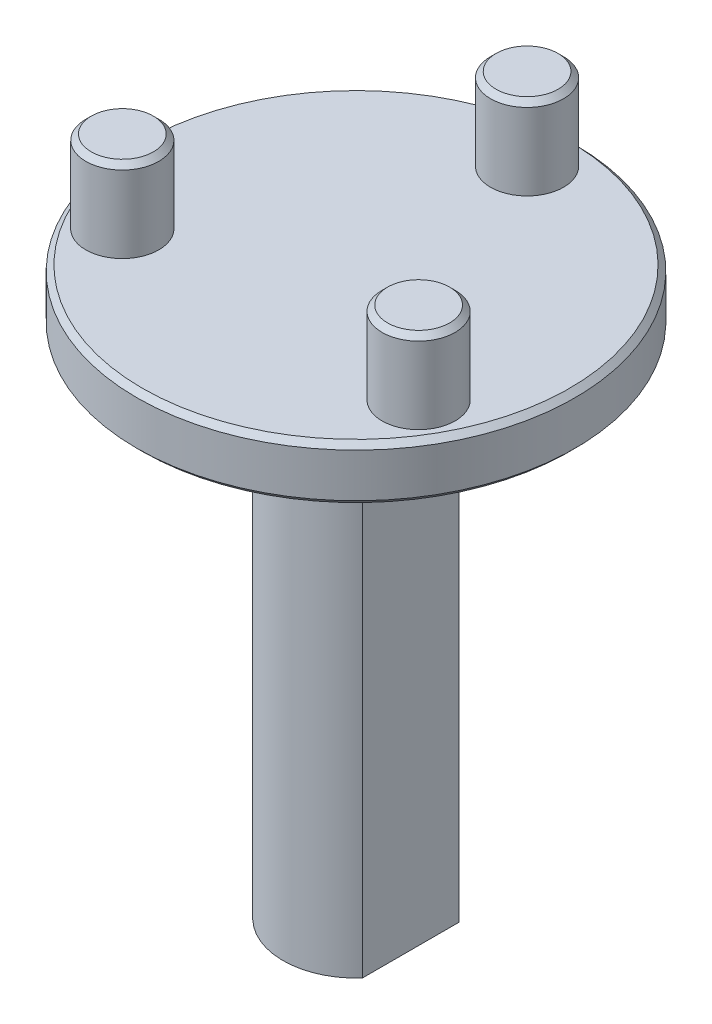
ISO-10303-21;
HEADER;
FILE_DESCRIPTION(('STEP AP214'),'2;1');
FILE_NAME('part.step','',(''),(''),'','','');
FILE_SCHEMA(('AUTOMOTIVE_DESIGN { 1 0 10303 214 1 1 1 1 }'));
ENDSEC;
DATA;
#1=APPLICATION_CONTEXT('core data for automotive mechanical design processes');
#2=APPLICATION_PROTOCOL_DEFINITION('international standard','automotive_design',2000,#1);
#3=PRODUCT_CONTEXT('',#1,'mechanical');
#4=PRODUCT('Part','Part','',(#3));
#5=PRODUCT_RELATED_PRODUCT_CATEGORY('part','',(#4));
#6=PRODUCT_DEFINITION_FORMATION('','',#4);
#7=PRODUCT_DEFINITION_CONTEXT('part definition',#1,'design');
#8=PRODUCT_DEFINITION('design','',#6,#7);
#9=PRODUCT_DEFINITION_SHAPE('','',#8);
#10=(LENGTH_UNIT() NAMED_UNIT(*) SI_UNIT(.MILLI.,.METRE.));
#11=(NAMED_UNIT(*) PLANE_ANGLE_UNIT() SI_UNIT($,.RADIAN.));
#12=(NAMED_UNIT(*) SI_UNIT($,.STERADIAN.) SOLID_ANGLE_UNIT());
#13=UNCERTAINTY_MEASURE_WITH_UNIT(LENGTH_MEASURE(1.E-05),#10,'distance_accuracy_value','');
#14=(GEOMETRIC_REPRESENTATION_CONTEXT(3) GLOBAL_UNCERTAINTY_ASSIGNED_CONTEXT((#13)) GLOBAL_UNIT_ASSIGNED_CONTEXT((#10,
#11,#12)) REPRESENTATION_CONTEXT('',''));
#15=CARTESIAN_POINT('',(0.,0.,0.));
#16=DIRECTION('',(0.,0.,1.));
#17=DIRECTION('',(1.,0.,0.));
#18=AXIS2_PLACEMENT_3D('',#15,#16,#17);
#19=CARTESIAN_POINT('',(0.,3.,0.));
#20=DIRECTION('',(0.,-1.,0.));
#21=DIRECTION('',(0.,0.,-1.));
#22=AXIS2_PLACEMENT_3D('',#19,#20,#21);
#23=CYLINDRICAL_SURFACE('',#22,12.);
#24=CARTESIAN_POINT('',(0.,0.299999999999998,0.));
#25=DIRECTION('',(0.,1.,0.));
#26=DIRECTION('',(0.,0.,1.));
#27=AXIS2_PLACEMENT_3D('',#24,#25,#26);
#28=CIRCLE('',#27,12.);
#29=CARTESIAN_POINT('',(0.,0.299999999999998,12.));
#30=VERTEX_POINT('',#29);
#31=EDGE_CURVE('E110',#30,#30,#28,.T.);
#32=ORIENTED_EDGE('',*,*,#31,.T.);
#33=EDGE_LOOP('',(#32));
#34=FACE_BOUND('',#33,.T.);
#35=CARTESIAN_POINT('',(0.,2.70000000000001,0.));
#36=DIRECTION('',(0.,1.,0.));
#37=DIRECTION('',(0.,0.,1.));
#38=AXIS2_PLACEMENT_3D('',#35,#36,#37);
#39=CIRCLE('',#38,12.);
#40=CARTESIAN_POINT('',(0.,2.70000000000001,12.));
#41=VERTEX_POINT('',#40);
#42=EDGE_CURVE('E107',#41,#41,#39,.F.);
#43=ORIENTED_EDGE('',*,*,#42,.T.);
#44=EDGE_LOOP('',(#43));
#45=FACE_BOUND('',#44,.T.);
#46=ADVANCED_FACE('F39',(#34,#45),#23,.T.);
#47=CARTESIAN_POINT('',(0.,3.,0.));
#48=DIRECTION('',(0.,1.,0.));
#49=DIRECTION('',(0.,0.,1.));
#50=AXIS2_PLACEMENT_3D('',#47,#48,#49);
#51=PLANE('',#50);
#52=CARTESIAN_POINT('',(0.,3.,0.));
#53=DIRECTION('',(0.,1.,0.));
#54=DIRECTION('',(0.,0.,1.));
#55=AXIS2_PLACEMENT_3D('',#52,#53,#54);
#56=CIRCLE('',#55,11.7);
#57=CARTESIAN_POINT('',(0.,3.,11.7));
#58=VERTEX_POINT('',#57);
#59=EDGE_CURVE('E116',#58,#58,#56,.T.);
#60=ORIENTED_EDGE('',*,*,#59,.T.);
#61=EDGE_LOOP('',(#60));
#62=FACE_BOUND('',#61,.T.);
#63=CARTESIAN_POINT('',(8.1146580334602,3.,4.68499999999998));
#64=DIRECTION('',(0.,1.,0.));
#65=DIRECTION('',(0.,0.,1.));
#66=AXIS2_PLACEMENT_3D('',#63,#64,#65);
#67=CIRCLE('',#66,2.);
#68=CARTESIAN_POINT('',(8.1146580334602,3.,6.68499999999998));
#69=VERTEX_POINT('',#68);
#70=EDGE_CURVE('E89',#69,#69,#67,.T.);
#71=ORIENTED_EDGE('',*,*,#70,.F.);
#72=EDGE_LOOP('',(#71));
#73=FACE_BOUND('',#72,.T.);
#74=CARTESIAN_POINT('',(-8.1146580334602,3.,4.68499999999998));
#75=DIRECTION('',(0.,1.,0.));
#76=DIRECTION('',(0.,0.,1.));
#77=AXIS2_PLACEMENT_3D('',#74,#75,#76);
#78=CIRCLE('',#77,2.);
#79=CARTESIAN_POINT('',(-8.1146580334602,3.,6.68499999999998));
#80=VERTEX_POINT('',#79);
#81=EDGE_CURVE('E97',#80,#80,#78,.T.);
#82=ORIENTED_EDGE('',*,*,#81,.F.);
#83=EDGE_LOOP('',(#82));
#84=FACE_BOUND('',#83,.T.);
#85=CARTESIAN_POINT('',(0.,3.,-9.37));
#86=DIRECTION('',(0.,1.,0.));
#87=DIRECTION('',(0.,0.,1.));
#88=AXIS2_PLACEMENT_3D('',#85,#86,#87);
#89=CIRCLE('',#88,2.);
#90=CARTESIAN_POINT('',(0.,3.,-7.37));
#91=VERTEX_POINT('',#90);
#92=EDGE_CURVE('E94',#91,#91,#89,.T.);
#93=ORIENTED_EDGE('',*,*,#92,.F.);
#94=EDGE_LOOP('',(#93));
#95=FACE_BOUND('',#94,.T.);
#96=ADVANCED_FACE('F139',(#62,#73,#84,#95),#51,.T.);
#97=CARTESIAN_POINT('',(0.,0.,0.));
#98=DIRECTION('',(0.,1.,0.));
#99=DIRECTION('',(0.,0.,1.));
#100=AXIS2_PLACEMENT_3D('',#97,#98,#99);
#101=PLANE('',#100);
#102=CARTESIAN_POINT('',(0.,0.,0.));
#103=DIRECTION('',(0.,1.,0.));
#104=DIRECTION('',(0.,0.,1.));
#105=AXIS2_PLACEMENT_3D('',#102,#103,#104);
#106=CIRCLE('',#105,11.7);
#107=CARTESIAN_POINT('',(0.,0.,11.7));
#108=VERTEX_POINT('',#107);
#109=EDGE_CURVE('E113',#108,#108,#106,.F.);
#110=ORIENTED_EDGE('',*,*,#109,.T.);
#111=EDGE_LOOP('',(#110));
#112=FACE_BOUND('',#111,.T.);
#113=CARTESIAN_POINT('',(0.,0.,0.));
#114=DIRECTION('',(0.,-1.,0.));
#115=DIRECTION('',(0.,0.,-1.));
#116=AXIS2_PLACEMENT_3D('',#113,#114,#115);
#117=CIRCLE('',#116,5.);
#118=CARTESIAN_POINT('',(0.,0.,-5.));
#119=VERTEX_POINT('',#118);
#120=EDGE_CURVE('E90',#119,#119,#117,.T.);
#121=ORIENTED_EDGE('',*,*,#120,.F.);
#122=EDGE_LOOP('',(#121));
#123=FACE_BOUND('',#122,.T.);
#124=ADVANCED_FACE('F145',(#112,#123),#101,.F.);
#125=CARTESIAN_POINT('',(0.,7.5,-9.37));
#126=DIRECTION('',(0.,-1.,0.));
#127=DIRECTION('',(0.,0.,-1.));
#128=AXIS2_PLACEMENT_3D('',#125,#126,#127);
#129=CYLINDRICAL_SURFACE('',#128,2.);
#130=CARTESIAN_POINT('',(0.,7.19999999999999,-9.37));
#131=DIRECTION('',(0.,1.,0.));
#132=DIRECTION('',(0.,0.,1.));
#133=AXIS2_PLACEMENT_3D('',#130,#131,#132);
#134=CIRCLE('',#133,2.);
#135=CARTESIAN_POINT('',(0.,7.19999999999999,-7.37));
#136=VERTEX_POINT('',#135);
#137=EDGE_CURVE('E122',#136,#136,#134,.F.);
#138=ORIENTED_EDGE('',*,*,#137,.T.);
#139=EDGE_LOOP('',(#138));
#140=FACE_BOUND('',#139,.T.);
#141=ORIENTED_EDGE('',*,*,#92,.T.);
#142=EDGE_LOOP('',(#141));
#143=FACE_BOUND('',#142,.T.);
#144=ADVANCED_FACE('F188',(#140,#143),#129,.T.);
#145=CARTESIAN_POINT('',(0.,7.5,-9.37));
#146=DIRECTION('',(0.,1.,0.));
#147=DIRECTION('',(0.,0.,1.));
#148=AXIS2_PLACEMENT_3D('',#145,#146,#147);
#149=PLANE('',#148);
#150=CARTESIAN_POINT('',(0.,7.5,-9.37));
#151=DIRECTION('',(0.,1.,0.));
#152=DIRECTION('',(0.,0.,1.));
#153=AXIS2_PLACEMENT_3D('',#150,#151,#152);
#154=CIRCLE('',#153,1.69999999999999);
#155=CARTESIAN_POINT('',(0.,7.5,-7.67000000000001));
#156=VERTEX_POINT('',#155);
#157=EDGE_CURVE('E119',#156,#156,#154,.T.);
#158=ORIENTED_EDGE('',*,*,#157,.T.);
#159=EDGE_LOOP('',(#158));
#160=FACE_BOUND('',#159,.T.);
#161=ADVANCED_FACE('F190',(#160),#149,.T.);
#162=CARTESIAN_POINT('',(-8.1146580334602,7.5,4.68499999999998));
#163=DIRECTION('',(0.,-1.,0.));
#164=DIRECTION('',(0.,0.,-1.));
#165=AXIS2_PLACEMENT_3D('',#162,#163,#164);
#166=CYLINDRICAL_SURFACE('',#165,2.);
#167=CARTESIAN_POINT('',(-8.1146580334602,7.2,4.68499999999998));
#168=DIRECTION('',(0.,1.,0.));
#169=DIRECTION('',(0.,0.,1.));
#170=AXIS2_PLACEMENT_3D('',#167,#168,#169);
#171=CIRCLE('',#170,2.);
#172=CARTESIAN_POINT('',(-8.1146580334602,7.2,6.68499999999998));
#173=VERTEX_POINT('',#172);
#174=EDGE_CURVE('E104',#173,#173,#171,.F.);
#175=ORIENTED_EDGE('',*,*,#174,.T.);
#176=EDGE_LOOP('',(#175));
#177=FACE_BOUND('',#176,.T.);
#178=ORIENTED_EDGE('',*,*,#81,.T.);
#179=EDGE_LOOP('',(#178));
#180=FACE_BOUND('',#179,.T.);
#181=ADVANCED_FACE('F197',(#177,#180),#166,.T.);
#182=CARTESIAN_POINT('',(-8.1146580334602,7.5,4.68499999999998));
#183=DIRECTION('',(0.,1.,0.));
#184=DIRECTION('',(0.,0.,1.));
#185=AXIS2_PLACEMENT_3D('',#182,#183,#184);
#186=PLANE('',#185);
#187=CARTESIAN_POINT('',(-8.1146580334602,7.5,4.68499999999998));
#188=DIRECTION('',(0.,1.,0.));
#189=DIRECTION('',(0.,0.,1.));
#190=AXIS2_PLACEMENT_3D('',#187,#188,#189);
#191=CIRCLE('',#190,1.7);
#192=CARTESIAN_POINT('',(-8.1146580334602,7.5,6.38499999999998));
#193=VERTEX_POINT('',#192);
#194=EDGE_CURVE('E93',#193,#193,#191,.T.);
#195=ORIENTED_EDGE('',*,*,#194,.T.);
#196=EDGE_LOOP('',(#195));
#197=FACE_BOUND('',#196,.T.);
#198=ADVANCED_FACE('F202',(#197),#186,.T.);
#199=CARTESIAN_POINT('',(8.1146580334602,7.5,4.68499999999998));
#200=DIRECTION('',(0.,-1.,0.));
#201=DIRECTION('',(0.,0.,-1.));
#202=AXIS2_PLACEMENT_3D('',#199,#200,#201);
#203=CYLINDRICAL_SURFACE('',#202,2.);
#204=CARTESIAN_POINT('',(8.1146580334602,7.2,4.68499999999998));
#205=DIRECTION('',(0.,1.,0.));
#206=DIRECTION('',(0.,0.,1.));
#207=AXIS2_PLACEMENT_3D('',#204,#205,#206);
#208=CIRCLE('',#207,2.);
#209=CARTESIAN_POINT('',(8.1146580334602,7.2,6.68499999999998));
#210=VERTEX_POINT('',#209);
#211=EDGE_CURVE('E11',#210,#210,#208,.F.);
#212=ORIENTED_EDGE('',*,*,#211,.T.);
#213=EDGE_LOOP('',(#212));
#214=FACE_BOUND('',#213,.T.);
#215=ORIENTED_EDGE('',*,*,#70,.T.);
#216=EDGE_LOOP('',(#215));
#217=FACE_BOUND('',#216,.T.);
#218=ADVANCED_FACE('F205',(#214,#217),#203,.T.);
#219=CARTESIAN_POINT('',(8.1146580334602,7.5,4.68499999999998));
#220=DIRECTION('',(0.,1.,0.));
#221=DIRECTION('',(0.,0.,1.));
#222=AXIS2_PLACEMENT_3D('',#219,#220,#221);
#223=PLANE('',#222);
#224=CARTESIAN_POINT('',(8.1146580334602,7.5,4.68499999999998));
#225=DIRECTION('',(0.,1.,0.));
#226=DIRECTION('',(0.,0.,1.));
#227=AXIS2_PLACEMENT_3D('',#224,#225,#226);
#228=CIRCLE('',#227,1.7);
#229=CARTESIAN_POINT('',(8.1146580334602,7.5,6.38499999999998));
#230=VERTEX_POINT('',#229);
#231=EDGE_CURVE('E48',#230,#230,#228,.T.);
#232=ORIENTED_EDGE('',*,*,#231,.T.);
#233=EDGE_LOOP('',(#232));
#234=FACE_BOUND('',#233,.T.);
#235=ADVANCED_FACE('F127',(#234),#223,.T.);
#236=CARTESIAN_POINT('',(0.,-1.,0.));
#237=DIRECTION('',(0.,1.,0.));
#238=DIRECTION('',(0.,0.,1.));
#239=AXIS2_PLACEMENT_3D('',#236,#237,#238);
#240=CYLINDRICAL_SURFACE('',#239,5.);
#241=CARTESIAN_POINT('',(0.,-1.,0.));
#242=DIRECTION('',(0.,-1.,0.));
#243=DIRECTION('',(0.,0.,-1.));
#244=AXIS2_PLACEMENT_3D('',#241,#242,#243);
#245=CIRCLE('',#244,5.);
#246=CARTESIAN_POINT('',(0.,-1.,-5.));
#247=VERTEX_POINT('',#246);
#248=EDGE_CURVE('E83',#247,#247,#245,.T.);
#249=ORIENTED_EDGE('',*,*,#248,.F.);
#250=EDGE_LOOP('',(#249));
#251=FACE_BOUND('',#250,.T.);
#252=ORIENTED_EDGE('',*,*,#120,.T.);
#253=EDGE_LOOP('',(#252));
#254=FACE_BOUND('',#253,.T.);
#255=ADVANCED_FACE('F212',(#251,#254),#240,.T.);
#256=CARTESIAN_POINT('',(0.,-1.,0.));
#257=DIRECTION('',(0.,-1.,0.));
#258=DIRECTION('',(0.,0.,-1.));
#259=AXIS2_PLACEMENT_3D('',#256,#257,#258);
#260=PLANE('',#259);
#261=CARTESIAN_POINT('',(0.,-1.,0.));
#262=DIRECTION('',(0.,-1.,0.));
#263=DIRECTION('',(0.,0.,-1.));
#264=AXIS2_PLACEMENT_3D('',#261,#262,#263);
#265=CIRCLE('',#264,4.);
#266=CARTESIAN_POINT('',(3.,-1.,2.64575131106459));
#267=VERTEX_POINT('',#266);
#268=CARTESIAN_POINT('',(3.,-1.,-2.64575131106459));
#269=VERTEX_POINT('',#268);
#270=EDGE_CURVE('E67',#267,#269,#265,.T.);
#271=ORIENTED_EDGE('',*,*,#270,.F.);
#272=DIRECTION('',(0.,0.,1.));
#273=VECTOR('',#272,1.);
#274=CARTESIAN_POINT('',(3.,-1.,2.64575131106459));
#275=LINE('',#274,#273);
#276=EDGE_CURVE('E54',#269,#267,#275,.T.);
#277=ORIENTED_EDGE('',*,*,#276,.F.);
#278=EDGE_LOOP('',(#271,#277));
#279=FACE_BOUND('',#278,.T.);
#280=ORIENTED_EDGE('',*,*,#248,.T.);
#281=EDGE_LOOP('',(#280));
#282=FACE_BOUND('',#281,.T.);
#283=ADVANCED_FACE('F68',(#279,#282),#260,.T.);
#284=CARTESIAN_POINT('',(0.,-28.,0.));
#285=DIRECTION('',(0.,1.,0.));
#286=DIRECTION('',(0.,0.,1.));
#287=AXIS2_PLACEMENT_3D('',#284,#285,#286);
#288=CYLINDRICAL_SURFACE('',#287,4.);
#289=ORIENTED_EDGE('',*,*,#270,.T.);
#290=DIRECTION('',(0.,1.,0.));
#291=VECTOR('',#290,1.);
#292=CARTESIAN_POINT('',(3.,-28.,-2.64575131106459));
#293=LINE('',#292,#291);
#294=CARTESIAN_POINT('',(3.,-28.,-2.64575131106459));
#295=VERTEX_POINT('',#294);
#296=EDGE_CURVE('E78',#295,#269,#293,.T.);
#297=ORIENTED_EDGE('',*,*,#296,.F.);
#298=CARTESIAN_POINT('',(0.,-28.,0.));
#299=DIRECTION('',(0.,-1.,0.));
#300=DIRECTION('',(0.,0.,-1.));
#301=AXIS2_PLACEMENT_3D('',#298,#299,#300);
#302=CIRCLE('',#301,4.);
#303=CARTESIAN_POINT('',(3.,-28.,2.64575131106459));
#304=VERTEX_POINT('',#303);
#305=EDGE_CURVE('E79',#304,#295,#302,.T.);
#306=ORIENTED_EDGE('',*,*,#305,.F.);
#307=DIRECTION('',(0.,1.,0.));
#308=VECTOR('',#307,1.);
#309=CARTESIAN_POINT('',(3.,-28.,2.64575131106459));
#310=LINE('',#309,#308);
#311=EDGE_CURVE('E76',#304,#267,#310,.T.);
#312=ORIENTED_EDGE('',*,*,#311,.T.);
#313=EDGE_LOOP('',(#289,#297,#306,#312));
#314=FACE_BOUND('',#313,.T.);
#315=ADVANCED_FACE('F81',(#314),#288,.T.);
#316=CARTESIAN_POINT('',(3.,-28.,2.64575131106459));
#317=DIRECTION('',(-1.,0.,0.));
#318=DIRECTION('',(0.,0.,1.));
#319=AXIS2_PLACEMENT_3D('',#316,#317,#318);
#320=PLANE('',#319);
#321=ORIENTED_EDGE('',*,*,#276,.T.);
#322=ORIENTED_EDGE('',*,*,#311,.F.);
#323=DIRECTION('',(0.,0.,1.));
#324=VECTOR('',#323,1.);
#325=CARTESIAN_POINT('',(3.,-28.,2.64575131106459));
#326=LINE('',#325,#324);
#327=EDGE_CURVE('E62',#295,#304,#326,.T.);
#328=ORIENTED_EDGE('',*,*,#327,.F.);
#329=ORIENTED_EDGE('',*,*,#296,.T.);
#330=EDGE_LOOP('',(#321,#322,#328,#329));
#331=FACE_BOUND('',#330,.T.);
#332=ADVANCED_FACE('F75',(#331),#320,.F.);
#333=CARTESIAN_POINT('',(0.,-28.,0.));
#334=DIRECTION('',(0.,-1.,0.));
#335=DIRECTION('',(0.,0.,-1.));
#336=AXIS2_PLACEMENT_3D('',#333,#334,#335);
#337=PLANE('',#336);
#338=ORIENTED_EDGE('',*,*,#305,.T.);
#339=ORIENTED_EDGE('',*,*,#327,.T.);
#340=EDGE_LOOP('',(#338,#339));
#341=FACE_BOUND('',#340,.T.);
#342=ADVANCED_FACE('F159',(#341),#337,.T.);
#343=CARTESIAN_POINT('',(-8.1146580334602,7.5,4.68499999999998));
#344=DIRECTION('',(0.,-1.,0.));
#345=DIRECTION('',(0.,0.,-1.));
#346=AXIS2_PLACEMENT_3D('',#343,#344,#345);
#347=CONICAL_SURFACE('',#346,1.7,0.785398163397452);
#348=ORIENTED_EDGE('',*,*,#174,.F.);
#349=EDGE_LOOP('',(#348));
#350=FACE_BOUND('',#349,.T.);
#351=ORIENTED_EDGE('',*,*,#194,.F.);
#352=EDGE_LOOP('',(#351));
#353=FACE_BOUND('',#352,.T.);
#354=ADVANCED_FACE('F152',(#350,#353),#347,.T.);
#355=CARTESIAN_POINT('',(0.,0.299999999999998,0.));
#356=DIRECTION('',(0.,1.,0.));
#357=DIRECTION('',(0.,0.,1.));
#358=AXIS2_PLACEMENT_3D('',#355,#356,#357);
#359=CONICAL_SURFACE('',#358,12.,0.785398163397448);
#360=ORIENTED_EDGE('',*,*,#109,.F.);
#361=EDGE_LOOP('',(#360));
#362=FACE_BOUND('',#361,.T.);
#363=ORIENTED_EDGE('',*,*,#31,.F.);
#364=EDGE_LOOP('',(#363));
#365=FACE_BOUND('',#364,.T.);
#366=ADVANCED_FACE('F158',(#362,#365),#359,.T.);
#367=CARTESIAN_POINT('',(0.,3.,0.));
#368=DIRECTION('',(0.,-1.,0.));
#369=DIRECTION('',(0.,0.,-1.));
#370=AXIS2_PLACEMENT_3D('',#367,#368,#369);
#371=CONICAL_SURFACE('',#370,11.7,0.785398163397445);
#372=ORIENTED_EDGE('',*,*,#42,.F.);
#373=EDGE_LOOP('',(#372));
#374=FACE_BOUND('',#373,.T.);
#375=ORIENTED_EDGE('',*,*,#59,.F.);
#376=EDGE_LOOP('',(#375));
#377=FACE_BOUND('',#376,.T.);
#378=ADVANCED_FACE('F135',(#374,#377),#371,.T.);
#379=CARTESIAN_POINT('',(0.,7.5,-9.37));
#380=DIRECTION('',(0.,-1.,0.));
#381=DIRECTION('',(0.,0.,-1.));
#382=AXIS2_PLACEMENT_3D('',#379,#380,#381);
#383=CONICAL_SURFACE('',#382,1.69999999999999,0.785398163397445);
#384=ORIENTED_EDGE('',*,*,#137,.F.);
#385=EDGE_LOOP('',(#384));
#386=FACE_BOUND('',#385,.T.);
#387=ORIENTED_EDGE('',*,*,#157,.F.);
#388=EDGE_LOOP('',(#387));
#389=FACE_BOUND('',#388,.T.);
#390=ADVANCED_FACE('F130',(#386,#389),#383,.T.);
#391=CARTESIAN_POINT('',(8.1146580334602,7.5,4.68499999999998));
#392=DIRECTION('',(0.,-1.,0.));
#393=DIRECTION('',(0.,0.,-1.));
#394=AXIS2_PLACEMENT_3D('',#391,#392,#393);
#395=CONICAL_SURFACE('',#394,1.7,0.785398163397453);
#396=ORIENTED_EDGE('',*,*,#211,.F.);
#397=EDGE_LOOP('',(#396));
#398=FACE_BOUND('',#397,.T.);
#399=ORIENTED_EDGE('',*,*,#231,.F.);
#400=EDGE_LOOP('',(#399));
#401=FACE_BOUND('',#400,.T.);
#402=ADVANCED_FACE('F42',(#398,#401),#395,.T.);
#403=CLOSED_SHELL('',(#46,#96,#124,#144,#161,#181,#198,#218,#235,#255,#283,#315,#332,#342,#354,
#366,#378,#390,#402));
#404=MANIFOLD_SOLID_BREP('B2',#403);
#405=ADVANCED_BREP_SHAPE_REPRESENTATION('',(#18,#404),#14);
#406=SHAPE_DEFINITION_REPRESENTATION(#9,#405);
ENDSEC;
END-ISO-10303-21;
